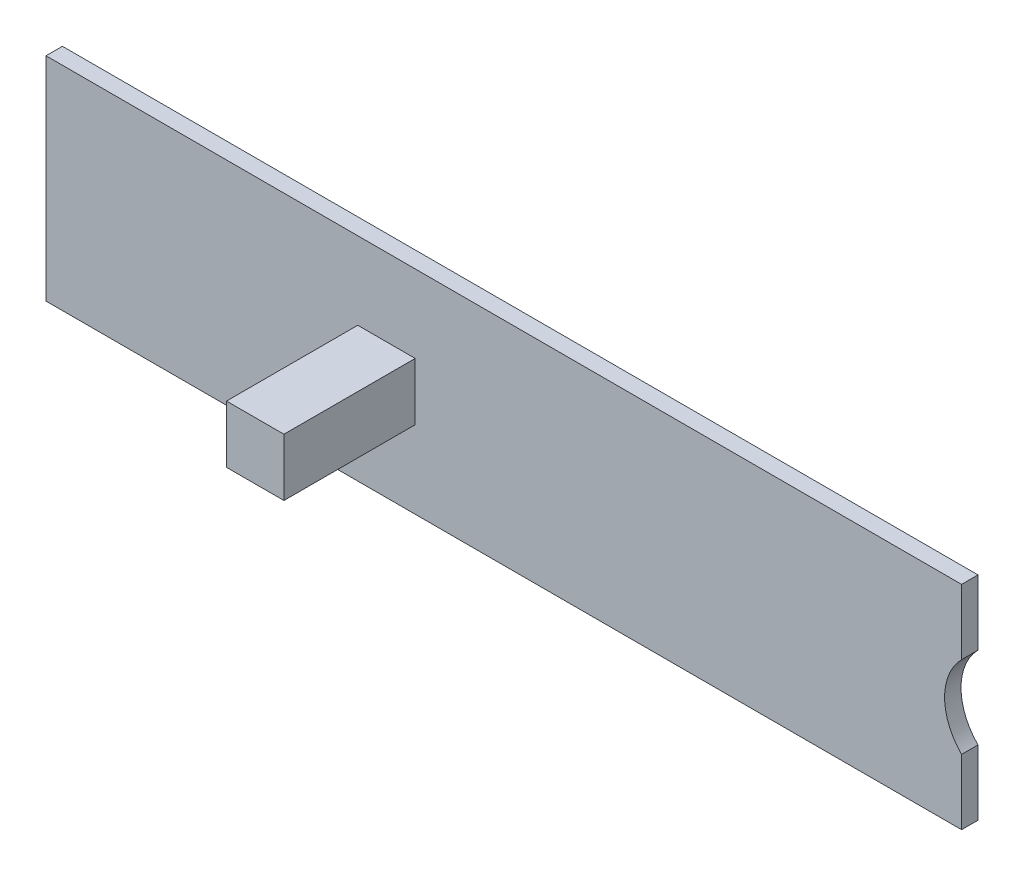
ISO-10303-21;
HEADER;
FILE_DESCRIPTION(('STEP AP214'),'2;1');
FILE_NAME('part.step','',(''),(''),'','','');
FILE_SCHEMA(('AUTOMOTIVE_DESIGN { 1 0 10303 214 1 1 1 1 }'));
ENDSEC;
DATA;
#1=APPLICATION_CONTEXT('core data for automotive mechanical design processes');
#2=APPLICATION_PROTOCOL_DEFINITION('international standard','automotive_design',2000,#1);
#3=PRODUCT_CONTEXT('',#1,'mechanical');
#4=PRODUCT('Part','Part','',(#3));
#5=PRODUCT_RELATED_PRODUCT_CATEGORY('part','',(#4));
#6=PRODUCT_DEFINITION_FORMATION('','',#4);
#7=PRODUCT_DEFINITION_CONTEXT('part definition',#1,'design');
#8=PRODUCT_DEFINITION('design','',#6,#7);
#9=PRODUCT_DEFINITION_SHAPE('','',#8);
#10=(LENGTH_UNIT() NAMED_UNIT(*) SI_UNIT(.MILLI.,.METRE.));
#11=(NAMED_UNIT(*) PLANE_ANGLE_UNIT() SI_UNIT($,.RADIAN.));
#12=(NAMED_UNIT(*) SI_UNIT($,.STERADIAN.) SOLID_ANGLE_UNIT());
#13=UNCERTAINTY_MEASURE_WITH_UNIT(LENGTH_MEASURE(1.E-05),#10,'distance_accuracy_value','');
#14=(GEOMETRIC_REPRESENTATION_CONTEXT(3) GLOBAL_UNCERTAINTY_ASSIGNED_CONTEXT((#13)) GLOBAL_UNIT_ASSIGNED_CONTEXT((#10,
#11,#12)) REPRESENTATION_CONTEXT('',''));
#15=CARTESIAN_POINT('',(0.,0.,0.));
#16=DIRECTION('',(0.,0.,1.));
#17=DIRECTION('',(1.,0.,0.));
#18=AXIS2_PLACEMENT_3D('',#15,#16,#17);
#19=CARTESIAN_POINT('',(111.6,0.,2.));
#20=DIRECTION('',(-1.,0.,0.));
#21=DIRECTION('',(0.,0.,1.));
#22=AXIS2_PLACEMENT_3D('',#19,#20,#21);
#23=PLANE('',#22);
#24=DIRECTION('',(0.,1.,0.));
#25=VECTOR('',#24,1.);
#26=CARTESIAN_POINT('',(111.6,0.,2.));
#27=LINE('',#26,#25);
#28=CARTESIAN_POINT('',(111.6,17.95,2.));
#29=VERTEX_POINT('',#28);
#30=CARTESIAN_POINT('',(111.6,25.9,2.));
#31=VERTEX_POINT('',#30);
#32=EDGE_CURVE('E130',#29,#31,#27,.T.);
#33=ORIENTED_EDGE('',*,*,#32,.F.);
#34=DIRECTION('',(0.,0.,-1.));
#35=VECTOR('',#34,1.);
#36=CARTESIAN_POINT('',(111.6,17.95,12.2122143476009));
#37=LINE('',#36,#35);
#38=CARTESIAN_POINT('',(111.6,17.95,0.));
#39=VERTEX_POINT('',#38);
#40=EDGE_CURVE('E117',#29,#39,#37,.T.);
#41=ORIENTED_EDGE('',*,*,#40,.T.);
#42=DIRECTION('',(0.,1.,0.));
#43=VECTOR('',#42,1.);
#44=CARTESIAN_POINT('',(111.6,0.,0.));
#45=LINE('',#44,#43);
#46=CARTESIAN_POINT('',(111.6,25.9,0.));
#47=VERTEX_POINT('',#46);
#48=EDGE_CURVE('E128',#39,#47,#45,.T.);
#49=ORIENTED_EDGE('',*,*,#48,.T.);
#50=DIRECTION('',(0.,0.,-1.));
#51=VECTOR('',#50,1.);
#52=CARTESIAN_POINT('',(111.6,25.9,2.));
#53=LINE('',#52,#51);
#54=EDGE_CURVE('E154',#31,#47,#53,.T.);
#55=ORIENTED_EDGE('',*,*,#54,.F.);
#56=EDGE_LOOP('',(#33,#41,#49,#55));
#57=FACE_BOUND('',#56,.T.);
#58=ADVANCED_FACE('F39',(#57),#23,.F.);
#59=CARTESIAN_POINT('',(0.,0.,2.));
#60=DIRECTION('',(0.,0.,-1.));
#61=DIRECTION('',(-1.,0.,0.));
#62=AXIS2_PLACEMENT_3D('',#59,#60,#61);
#63=PLANE('',#62);
#64=CARTESIAN_POINT('',(111.6,0.,2.));
#65=VERTEX_POINT('',#64);
#66=CARTESIAN_POINT('',(111.6,7.94999999999999,2.));
#67=VERTEX_POINT('',#66);
#68=EDGE_CURVE('E164',#65,#67,#27,.T.);
#69=ORIENTED_EDGE('',*,*,#68,.T.);
#70=CARTESIAN_POINT('',(116.6,12.95,2.));
#71=DIRECTION('',(0.,0.,-1.));
#72=DIRECTION('',(-1.,0.,0.));
#73=AXIS2_PLACEMENT_3D('',#70,#71,#72);
#74=CIRCLE('',#73,7.07106781186548);
#75=EDGE_CURVE('E215',#29,#67,#74,.F.);
#76=ORIENTED_EDGE('',*,*,#75,.F.);
#77=ORIENTED_EDGE('',*,*,#32,.T.);
#78=DIRECTION('',(-1.,0.,0.));
#79=VECTOR('',#78,1.);
#80=CARTESIAN_POINT('',(0.,25.9,2.));
#81=LINE('',#80,#79);
#82=CARTESIAN_POINT('',(0.,25.9,2.));
#83=VERTEX_POINT('',#82);
#84=EDGE_CURVE('E155',#31,#83,#81,.T.);
#85=ORIENTED_EDGE('',*,*,#84,.T.);
#86=DIRECTION('',(0.,-1.,0.));
#87=VECTOR('',#86,1.);
#88=CARTESIAN_POINT('',(0.,0.,2.));
#89=LINE('',#88,#87);
#90=CARTESIAN_POINT('',(0.,0.,2.));
#91=VERTEX_POINT('',#90);
#92=EDGE_CURVE('E149',#83,#91,#89,.T.);
#93=ORIENTED_EDGE('',*,*,#92,.T.);
#94=DIRECTION('',(1.,0.,0.));
#95=VECTOR('',#94,1.);
#96=CARTESIAN_POINT('',(0.,0.,2.));
#97=LINE('',#96,#95);
#98=EDGE_CURVE('E169',#91,#65,#97,.T.);
#99=ORIENTED_EDGE('',*,*,#98,.T.);
#100=EDGE_LOOP('',(#69,#76,#77,#85,#93,#99));
#101=FACE_BOUND('',#100,.T.);
#102=DIRECTION('',(0.,-1.,0.));
#103=VECTOR('',#102,1.);
#104=CARTESIAN_POINT('',(38.,16.45,2.));
#105=LINE('',#104,#103);
#106=CARTESIAN_POINT('',(38.,16.45,2.));
#107=VERTEX_POINT('',#106);
#108=CARTESIAN_POINT('',(38.,9.45,2.));
#109=VERTEX_POINT('',#108);
#110=EDGE_CURVE('E211',#107,#109,#105,.T.);
#111=ORIENTED_EDGE('',*,*,#110,.F.);
#112=DIRECTION('',(-1.,0.,0.));
#113=VECTOR('',#112,1.);
#114=CARTESIAN_POINT('',(38.,16.45,2.));
#115=LINE('',#114,#113);
#116=CARTESIAN_POINT('',(45.,16.45,2.));
#117=VERTEX_POINT('',#116);
#118=EDGE_CURVE('E200',#117,#107,#115,.T.);
#119=ORIENTED_EDGE('',*,*,#118,.F.);
#120=DIRECTION('',(0.,1.,0.));
#121=VECTOR('',#120,1.);
#122=CARTESIAN_POINT('',(45.,16.45,2.));
#123=LINE('',#122,#121);
#124=CARTESIAN_POINT('',(45.,9.45,2.));
#125=VERTEX_POINT('',#124);
#126=EDGE_CURVE('E205',#125,#117,#123,.T.);
#127=ORIENTED_EDGE('',*,*,#126,.F.);
#128=DIRECTION('',(1.,0.,0.));
#129=VECTOR('',#128,1.);
#130=CARTESIAN_POINT('',(38.,9.45,2.));
#131=LINE('',#130,#129);
#132=EDGE_CURVE('E63',#109,#125,#131,.T.);
#133=ORIENTED_EDGE('',*,*,#132,.F.);
#134=EDGE_LOOP('',(#111,#119,#127,#133));
#135=FACE_BOUND('',#134,.T.);
#136=ADVANCED_FACE('F231',(#101,#135),#63,.F.);
#137=CARTESIAN_POINT('',(0.,0.,2.));
#138=DIRECTION('',(1.,0.,0.));
#139=DIRECTION('',(0.,0.,-1.));
#140=AXIS2_PLACEMENT_3D('',#137,#138,#139);
#141=PLANE('',#140);
#142=DIRECTION('',(0.,-1.,0.));
#143=VECTOR('',#142,1.);
#144=CARTESIAN_POINT('',(0.,0.,0.));
#145=LINE('',#144,#143);
#146=CARTESIAN_POINT('',(0.,25.9,0.));
#147=VERTEX_POINT('',#146);
#148=CARTESIAN_POINT('',(0.,0.,0.));
#149=VERTEX_POINT('',#148);
#150=EDGE_CURVE('E143',#147,#149,#145,.T.);
#151=ORIENTED_EDGE('',*,*,#150,.T.);
#152=DIRECTION('',(0.,0.,-1.));
#153=VECTOR('',#152,1.);
#154=CARTESIAN_POINT('',(0.,0.,2.));
#155=LINE('',#154,#153);
#156=EDGE_CURVE('E11',#91,#149,#155,.T.);
#157=ORIENTED_EDGE('',*,*,#156,.F.);
#158=ORIENTED_EDGE('',*,*,#92,.F.);
#159=DIRECTION('',(0.,0.,-1.));
#160=VECTOR('',#159,1.);
#161=CARTESIAN_POINT('',(0.,25.9,2.));
#162=LINE('',#161,#160);
#163=EDGE_CURVE('E150',#83,#147,#162,.T.);
#164=ORIENTED_EDGE('',*,*,#163,.T.);
#165=EDGE_LOOP('',(#151,#157,#158,#164));
#166=FACE_BOUND('',#165,.T.);
#167=ADVANCED_FACE('F41',(#166),#141,.F.);
#168=CARTESIAN_POINT('',(0.,0.,2.));
#169=DIRECTION('',(0.,1.,0.));
#170=DIRECTION('',(0.,0.,1.));
#171=AXIS2_PLACEMENT_3D('',#168,#169,#170);
#172=PLANE('',#171);
#173=DIRECTION('',(1.,0.,0.));
#174=VECTOR('',#173,1.);
#175=CARTESIAN_POINT('',(0.,0.,0.));
#176=LINE('',#175,#174);
#177=CARTESIAN_POINT('',(111.6,0.,0.));
#178=VERTEX_POINT('',#177);
#179=EDGE_CURVE('E139',#149,#178,#176,.T.);
#180=ORIENTED_EDGE('',*,*,#179,.T.);
#181=DIRECTION('',(0.,0.,-1.));
#182=VECTOR('',#181,1.);
#183=CARTESIAN_POINT('',(111.6,0.,2.));
#184=LINE('',#183,#182);
#185=EDGE_CURVE('E48',#65,#178,#184,.T.);
#186=ORIENTED_EDGE('',*,*,#185,.F.);
#187=ORIENTED_EDGE('',*,*,#98,.F.);
#188=ORIENTED_EDGE('',*,*,#156,.T.);
#189=EDGE_LOOP('',(#180,#186,#187,#188));
#190=FACE_BOUND('',#189,.T.);
#191=ADVANCED_FACE('F168',(#190),#172,.F.);
#192=CARTESIAN_POINT('',(111.6,7.94999999999998,0.));
#193=VERTEX_POINT('',#192);
#194=EDGE_CURVE('E138',#178,#193,#45,.T.);
#195=ORIENTED_EDGE('',*,*,#194,.T.);
#196=DIRECTION('',(0.,0.,-1.));
#197=VECTOR('',#196,1.);
#198=CARTESIAN_POINT('',(111.6,7.94999999999999,12.2122143476009));
#199=LINE('',#198,#197);
#200=EDGE_CURVE('E55',#67,#193,#199,.T.);
#201=ORIENTED_EDGE('',*,*,#200,.F.);
#202=ORIENTED_EDGE('',*,*,#68,.F.);
#203=ORIENTED_EDGE('',*,*,#185,.T.);
#204=EDGE_LOOP('',(#195,#201,#202,#203));
#205=FACE_BOUND('',#204,.T.);
#206=ADVANCED_FACE('F162',(#205),#23,.F.);
#207=CARTESIAN_POINT('',(0.,25.9,2.));
#208=DIRECTION('',(0.,-1.,0.));
#209=DIRECTION('',(0.,0.,-1.));
#210=AXIS2_PLACEMENT_3D('',#207,#208,#209);
#211=PLANE('',#210);
#212=DIRECTION('',(-1.,0.,0.));
#213=VECTOR('',#212,1.);
#214=CARTESIAN_POINT('',(0.,25.9,0.));
#215=LINE('',#214,#213);
#216=EDGE_CURVE('E136',#47,#147,#215,.T.);
#217=ORIENTED_EDGE('',*,*,#216,.T.);
#218=ORIENTED_EDGE('',*,*,#163,.F.);
#219=ORIENTED_EDGE('',*,*,#84,.F.);
#220=ORIENTED_EDGE('',*,*,#54,.T.);
#221=EDGE_LOOP('',(#217,#218,#219,#220));
#222=FACE_BOUND('',#221,.T.);
#223=ADVANCED_FACE('F234',(#222),#211,.F.);
#224=CARTESIAN_POINT('',(0.,0.,0.));
#225=DIRECTION('',(0.,0.,-1.));
#226=DIRECTION('',(-1.,0.,0.));
#227=AXIS2_PLACEMENT_3D('',#224,#225,#226);
#228=PLANE('',#227);
#229=CARTESIAN_POINT('',(116.6,12.95,0.));
#230=DIRECTION('',(0.,0.,-1.));
#231=DIRECTION('',(-1.,0.,0.));
#232=AXIS2_PLACEMENT_3D('',#229,#230,#231);
#233=CIRCLE('',#232,7.07106781186548);
#234=EDGE_CURVE('E114',#193,#39,#233,.T.);
#235=ORIENTED_EDGE('',*,*,#234,.F.);
#236=ORIENTED_EDGE('',*,*,#194,.F.);
#237=ORIENTED_EDGE('',*,*,#179,.F.);
#238=ORIENTED_EDGE('',*,*,#150,.F.);
#239=ORIENTED_EDGE('',*,*,#216,.F.);
#240=ORIENTED_EDGE('',*,*,#48,.F.);
#241=EDGE_LOOP('',(#235,#236,#237,#238,#239,#240));
#242=FACE_BOUND('',#241,.T.);
#243=ADVANCED_FACE('F134',(#242),#228,.T.);
#244=CARTESIAN_POINT('',(38.,16.45,18.));
#245=DIRECTION('',(1.,0.,0.));
#246=DIRECTION('',(0.,0.,-1.));
#247=AXIS2_PLACEMENT_3D('',#244,#245,#246);
#248=PLANE('',#247);
#249=ORIENTED_EDGE('',*,*,#110,.T.);
#250=DIRECTION('',(0.,0.,-1.));
#251=VECTOR('',#250,1.);
#252=CARTESIAN_POINT('',(38.,9.45,18.));
#253=LINE('',#252,#251);
#254=CARTESIAN_POINT('',(38.,9.45,18.));
#255=VERTEX_POINT('',#254);
#256=EDGE_CURVE('E175',#255,#109,#253,.T.);
#257=ORIENTED_EDGE('',*,*,#256,.F.);
#258=DIRECTION('',(0.,-1.,0.));
#259=VECTOR('',#258,1.);
#260=CARTESIAN_POINT('',(38.,16.45,18.));
#261=LINE('',#260,#259);
#262=CARTESIAN_POINT('',(38.,16.45,18.));
#263=VERTEX_POINT('',#262);
#264=EDGE_CURVE('E204',#263,#255,#261,.T.);
#265=ORIENTED_EDGE('',*,*,#264,.F.);
#266=DIRECTION('',(0.,0.,-1.));
#267=VECTOR('',#266,1.);
#268=CARTESIAN_POINT('',(38.,16.45,18.));
#269=LINE('',#268,#267);
#270=EDGE_CURVE('E195',#263,#107,#269,.T.);
#271=ORIENTED_EDGE('',*,*,#270,.T.);
#272=EDGE_LOOP('',(#249,#257,#265,#271));
#273=FACE_BOUND('',#272,.T.);
#274=ADVANCED_FACE('F241',(#273),#248,.F.);
#275=CARTESIAN_POINT('',(38.,9.45,18.));
#276=DIRECTION('',(0.,1.,0.));
#277=DIRECTION('',(0.,0.,1.));
#278=AXIS2_PLACEMENT_3D('',#275,#276,#277);
#279=PLANE('',#278);
#280=ORIENTED_EDGE('',*,*,#132,.T.);
#281=DIRECTION('',(0.,0.,-1.));
#282=VECTOR('',#281,1.);
#283=CARTESIAN_POINT('',(45.,9.45,18.));
#284=LINE('',#283,#282);
#285=CARTESIAN_POINT('',(45.,9.45,18.));
#286=VERTEX_POINT('',#285);
#287=EDGE_CURVE('E177',#286,#125,#284,.T.);
#288=ORIENTED_EDGE('',*,*,#287,.F.);
#289=DIRECTION('',(1.,0.,0.));
#290=VECTOR('',#289,1.);
#291=CARTESIAN_POINT('',(38.,9.45,18.));
#292=LINE('',#291,#290);
#293=EDGE_CURVE('E221',#255,#286,#292,.T.);
#294=ORIENTED_EDGE('',*,*,#293,.F.);
#295=ORIENTED_EDGE('',*,*,#256,.T.);
#296=EDGE_LOOP('',(#280,#288,#294,#295));
#297=FACE_BOUND('',#296,.T.);
#298=ADVANCED_FACE('F310',(#297),#279,.F.);
#299=CARTESIAN_POINT('',(45.,16.45,18.));
#300=DIRECTION('',(-1.,0.,0.));
#301=DIRECTION('',(0.,0.,1.));
#302=AXIS2_PLACEMENT_3D('',#299,#300,#301);
#303=PLANE('',#302);
#304=ORIENTED_EDGE('',*,*,#126,.T.);
#305=DIRECTION('',(0.,0.,-1.));
#306=VECTOR('',#305,1.);
#307=CARTESIAN_POINT('',(45.,16.45,18.));
#308=LINE('',#307,#306);
#309=CARTESIAN_POINT('',(45.,16.45,18.));
#310=VERTEX_POINT('',#309);
#311=EDGE_CURVE('E191',#310,#117,#308,.T.);
#312=ORIENTED_EDGE('',*,*,#311,.F.);
#313=DIRECTION('',(0.,1.,0.));
#314=VECTOR('',#313,1.);
#315=CARTESIAN_POINT('',(45.,16.45,18.));
#316=LINE('',#315,#314);
#317=EDGE_CURVE('E218',#286,#310,#316,.T.);
#318=ORIENTED_EDGE('',*,*,#317,.F.);
#319=ORIENTED_EDGE('',*,*,#287,.T.);
#320=EDGE_LOOP('',(#304,#312,#318,#319));
#321=FACE_BOUND('',#320,.T.);
#322=ADVANCED_FACE('F302',(#321),#303,.F.);
#323=CARTESIAN_POINT('',(38.,16.45,18.));
#324=DIRECTION('',(0.,-1.,0.));
#325=DIRECTION('',(0.,0.,-1.));
#326=AXIS2_PLACEMENT_3D('',#323,#324,#325);
#327=PLANE('',#326);
#328=ORIENTED_EDGE('',*,*,#118,.T.);
#329=ORIENTED_EDGE('',*,*,#270,.F.);
#330=DIRECTION('',(-1.,0.,0.));
#331=VECTOR('',#330,1.);
#332=CARTESIAN_POINT('',(38.,16.45,18.));
#333=LINE('',#332,#331);
#334=EDGE_CURVE('E199',#310,#263,#333,.T.);
#335=ORIENTED_EDGE('',*,*,#334,.F.);
#336=ORIENTED_EDGE('',*,*,#311,.T.);
#337=EDGE_LOOP('',(#328,#329,#335,#336));
#338=FACE_BOUND('',#337,.T.);
#339=ADVANCED_FACE('F294',(#338),#327,.F.);
#340=CARTESIAN_POINT('',(0.,0.,18.));
#341=DIRECTION('',(0.,0.,1.));
#342=DIRECTION('',(1.,0.,0.));
#343=AXIS2_PLACEMENT_3D('',#340,#341,#342);
#344=PLANE('',#343);
#345=ORIENTED_EDGE('',*,*,#264,.T.);
#346=ORIENTED_EDGE('',*,*,#293,.T.);
#347=ORIENTED_EDGE('',*,*,#317,.T.);
#348=ORIENTED_EDGE('',*,*,#334,.T.);
#349=EDGE_LOOP('',(#345,#346,#347,#348));
#350=FACE_BOUND('',#349,.T.);
#351=ADVANCED_FACE('F286',(#350),#344,.T.);
#352=CARTESIAN_POINT('',(116.6,12.95,12.2122143476009));
#353=DIRECTION('',(0.,0.,-1.));
#354=DIRECTION('',(-1.,0.,0.));
#355=AXIS2_PLACEMENT_3D('',#352,#353,#354);
#356=CYLINDRICAL_SURFACE('',#355,7.07106781186548);
#357=ORIENTED_EDGE('',*,*,#75,.T.);
#358=ORIENTED_EDGE('',*,*,#200,.T.);
#359=ORIENTED_EDGE('',*,*,#234,.T.);
#360=ORIENTED_EDGE('',*,*,#40,.F.);
#361=EDGE_LOOP('',(#357,#358,#359,#360));
#362=FACE_BOUND('',#361,.T.);
#363=ADVANCED_FACE('F116',(#362),#356,.F.);
#364=CLOSED_SHELL('',(#58,#136,#167,#191,#206,#223,#243,#274,#298,#322,#339,#351,#363));
#365=MANIFOLD_SOLID_BREP('B2',#364);
#366=ADVANCED_BREP_SHAPE_REPRESENTATION('',(#18,#365),#14);
#367=SHAPE_DEFINITION_REPRESENTATION(#9,#366);
ENDSEC;
END-ISO-10303-21;
